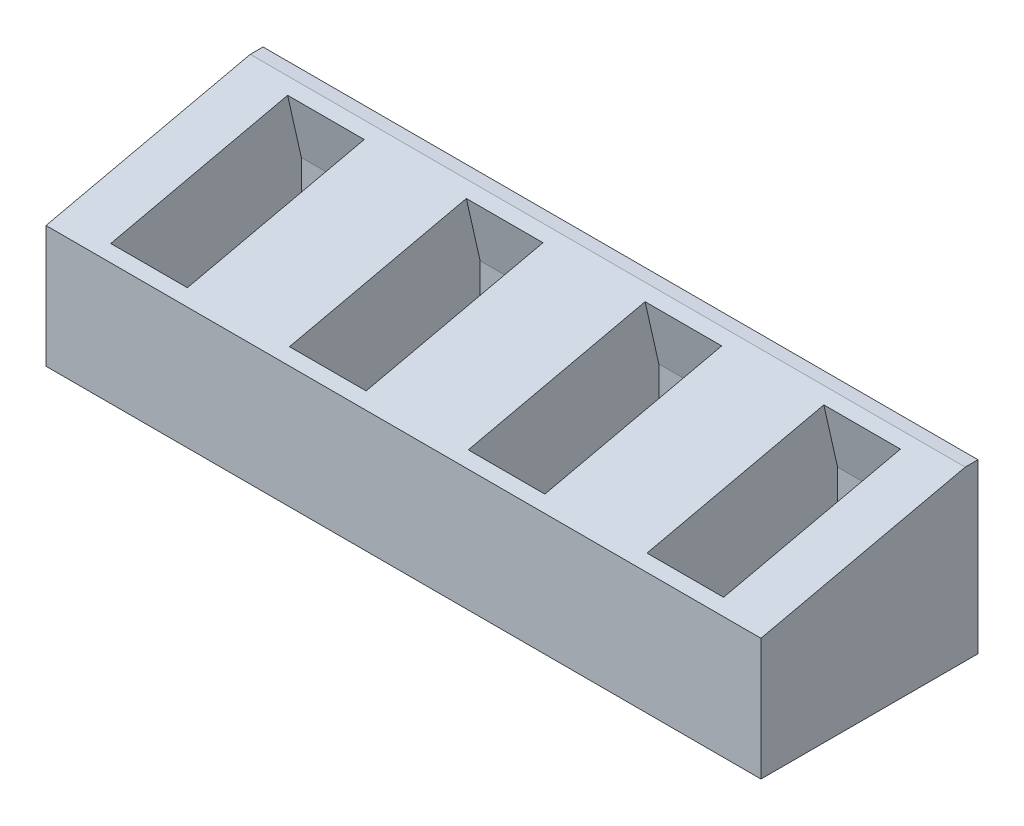
ISO-10303-21;
HEADER;
FILE_DESCRIPTION(('STEP AP214'),'2;1');
FILE_NAME('part.step','',(''),(''),'','','');
FILE_SCHEMA(('AUTOMOTIVE_DESIGN { 1 0 10303 214 1 1 1 1 }'));
ENDSEC;
DATA;
#1=APPLICATION_CONTEXT('core data for automotive mechanical design processes');
#2=APPLICATION_PROTOCOL_DEFINITION('international standard','automotive_design',2000,#1);
#3=PRODUCT_CONTEXT('',#1,'mechanical');
#4=PRODUCT('Part','Part','',(#3));
#5=PRODUCT_RELATED_PRODUCT_CATEGORY('part','',(#4));
#6=PRODUCT_DEFINITION_FORMATION('','',#4);
#7=PRODUCT_DEFINITION_CONTEXT('part definition',#1,'design');
#8=PRODUCT_DEFINITION('design','',#6,#7);
#9=PRODUCT_DEFINITION_SHAPE('','',#8);
#10=(LENGTH_UNIT() NAMED_UNIT(*) SI_UNIT(.MILLI.,.METRE.));
#11=(NAMED_UNIT(*) PLANE_ANGLE_UNIT() SI_UNIT($,.RADIAN.));
#12=(NAMED_UNIT(*) SI_UNIT($,.STERADIAN.) SOLID_ANGLE_UNIT());
#13=UNCERTAINTY_MEASURE_WITH_UNIT(LENGTH_MEASURE(1.E-05),#10,'distance_accuracy_value','');
#14=(GEOMETRIC_REPRESENTATION_CONTEXT(3) GLOBAL_UNCERTAINTY_ASSIGNED_CONTEXT((#13)) GLOBAL_UNIT_ASSIGNED_CONTEXT((#10,
#11,#12)) REPRESENTATION_CONTEXT('',''));
#15=CARTESIAN_POINT('',(0.,0.,0.));
#16=DIRECTION('',(0.,0.,1.));
#17=DIRECTION('',(1.,0.,0.));
#18=AXIS2_PLACEMENT_3D('',#15,#16,#17);
#19=CARTESIAN_POINT('',(0.,0.,203.2));
#20=DIRECTION('',(-1.,0.,0.));
#21=DIRECTION('',(0.,0.,1.));
#22=AXIS2_PLACEMENT_3D('',#19,#20,#21);
#23=PLANE('',#22);
#24=DIRECTION('',(0.,-0.220134843400727,0.975469451454497));
#25=VECTOR('',#24,1.);
#26=CARTESIAN_POINT('',(0.,115.398777640864,229.242119316734));
#27=LINE('',#26,#25);
#28=CARTESIAN_POINT('',(0.,167.132,0.));
#29=VERTEX_POINT('',#28);
#30=CARTESIAN_POINT('',(0.,121.275720121291,203.2));
#31=VERTEX_POINT('',#30);
#32=EDGE_CURVE('E453',#29,#31,#27,.T.);
#33=ORIENTED_EDGE('',*,*,#32,.F.);
#34=DIRECTION('',(0.,0.,1.));
#35=VECTOR('',#34,1.);
#36=CARTESIAN_POINT('',(0.,167.132,-12.7));
#37=LINE('',#36,#35);
#38=CARTESIAN_POINT('',(0.,167.132,-12.7));
#39=VERTEX_POINT('',#38);
#40=EDGE_CURVE('E241',#39,#29,#37,.T.);
#41=ORIENTED_EDGE('',*,*,#40,.F.);
#42=DIRECTION('',(0.,1.,0.));
#43=VECTOR('',#42,1.);
#44=CARTESIAN_POINT('',(0.,167.132,-12.7));
#45=LINE('',#44,#43);
#46=CARTESIAN_POINT('',(0.,0.,-12.7));
#47=VERTEX_POINT('',#46);
#48=EDGE_CURVE('E225',#47,#39,#45,.T.);
#49=ORIENTED_EDGE('',*,*,#48,.F.);
#50=DIRECTION('',(0.,0.,-1.));
#51=VECTOR('',#50,1.);
#52=CARTESIAN_POINT('',(0.,0.,203.2));
#53=LINE('',#52,#51);
#54=CARTESIAN_POINT('',(0.,0.,203.2));
#55=VERTEX_POINT('',#54);
#56=EDGE_CURVE('E216',#55,#47,#53,.T.);
#57=ORIENTED_EDGE('',*,*,#56,.F.);
#58=DIRECTION('',(0.,1.,0.));
#59=VECTOR('',#58,1.);
#60=CARTESIAN_POINT('',(0.,0.,203.2));
#61=LINE('',#60,#59);
#62=EDGE_CURVE('E457',#55,#31,#61,.T.);
#63=ORIENTED_EDGE('',*,*,#62,.T.);
#64=EDGE_LOOP('',(#33,#41,#49,#57,#63));
#65=FACE_BOUND('',#64,.T.);
#66=ADVANCED_FACE('F39',(#65),#23,.T.);
#67=CARTESIAN_POINT('',(0.,0.,203.2));
#68=DIRECTION('',(0.,1.,0.));
#69=DIRECTION('',(0.,0.,1.));
#70=AXIS2_PLACEMENT_3D('',#67,#68,#69);
#71=PLANE('',#70);
#72=ORIENTED_EDGE('',*,*,#56,.T.);
#73=DIRECTION('',(-1.,0.,0.));
#74=VECTOR('',#73,1.);
#75=CARTESIAN_POINT('',(711.2,0.,-12.7));
#76=LINE('',#75,#74);
#77=CARTESIAN_POINT('',(711.2,0.,-12.7));
#78=VERTEX_POINT('',#77);
#79=EDGE_CURVE('E220',#78,#47,#76,.T.);
#80=ORIENTED_EDGE('',*,*,#79,.F.);
#81=DIRECTION('',(0.,0.,-1.));
#82=VECTOR('',#81,1.);
#83=CARTESIAN_POINT('',(711.2,0.,203.2));
#84=LINE('',#83,#82);
#85=CARTESIAN_POINT('',(711.2,0.,203.2));
#86=VERTEX_POINT('',#85);
#87=EDGE_CURVE('E203',#86,#78,#84,.T.);
#88=ORIENTED_EDGE('',*,*,#87,.F.);
#89=DIRECTION('',(1.,0.,0.));
#90=VECTOR('',#89,1.);
#91=CARTESIAN_POINT('',(0.,0.,203.2));
#92=LINE('',#91,#90);
#93=EDGE_CURVE('E217',#55,#86,#92,.T.);
#94=ORIENTED_EDGE('',*,*,#93,.F.);
#95=EDGE_LOOP('',(#72,#80,#88,#94));
#96=FACE_BOUND('',#95,.T.);
#97=ADVANCED_FACE('F221',(#96),#71,.F.);
#98=CARTESIAN_POINT('',(711.2,167.132,203.2));
#99=DIRECTION('',(1.,0.,0.));
#100=DIRECTION('',(0.,0.,-1.));
#101=AXIS2_PLACEMENT_3D('',#98,#99,#100);
#102=PLANE('',#101);
#103=DIRECTION('',(0.,0.220134843400727,-0.975469451454497));
#104=VECTOR('',#103,1.);
#105=CARTESIAN_POINT('',(711.2,167.132,0.));
#106=LINE('',#105,#104);
#107=CARTESIAN_POINT('',(711.2,121.275720121291,203.2));
#108=VERTEX_POINT('',#107);
#109=CARTESIAN_POINT('',(711.2,167.132,0.));
#110=VERTEX_POINT('',#109);
#111=EDGE_CURVE('E446',#108,#110,#106,.T.);
#112=ORIENTED_EDGE('',*,*,#111,.F.);
#113=DIRECTION('',(0.,-1.,0.));
#114=VECTOR('',#113,1.);
#115=CARTESIAN_POINT('',(711.2,167.132,203.2));
#116=LINE('',#115,#114);
#117=EDGE_CURVE('E211',#108,#86,#116,.T.);
#118=ORIENTED_EDGE('',*,*,#117,.T.);
#119=ORIENTED_EDGE('',*,*,#87,.T.);
#120=DIRECTION('',(0.,-1.,0.));
#121=VECTOR('',#120,1.);
#122=CARTESIAN_POINT('',(711.2,167.132,-12.7));
#123=LINE('',#122,#121);
#124=CARTESIAN_POINT('',(711.2,167.132,-12.7));
#125=VERTEX_POINT('',#124);
#126=EDGE_CURVE('E209',#125,#78,#123,.T.);
#127=ORIENTED_EDGE('',*,*,#126,.F.);
#128=DIRECTION('',(0.,0.,1.));
#129=VECTOR('',#128,1.);
#130=CARTESIAN_POINT('',(711.2,167.132,-12.7));
#131=LINE('',#130,#129);
#132=EDGE_CURVE('E238',#125,#110,#131,.T.);
#133=ORIENTED_EDGE('',*,*,#132,.T.);
#134=EDGE_LOOP('',(#112,#118,#119,#127,#133));
#135=FACE_BOUND('',#134,.T.);
#136=ADVANCED_FACE('F206',(#135),#102,.T.);
#137=CARTESIAN_POINT('',(0.,0.,203.2));
#138=DIRECTION('',(0.,0.,-1.));
#139=DIRECTION('',(-1.,0.,0.));
#140=AXIS2_PLACEMENT_3D('',#137,#138,#139);
#141=PLANE('',#140);
#142=ORIENTED_EDGE('',*,*,#117,.F.);
#143=DIRECTION('',(1.,0.,0.));
#144=VECTOR('',#143,1.);
#145=CARTESIAN_POINT('',(-208.28,121.275720121291,203.2));
#146=LINE('',#145,#144);
#147=EDGE_CURVE('E450',#31,#108,#146,.T.);
#148=ORIENTED_EDGE('',*,*,#147,.F.);
#149=ORIENTED_EDGE('',*,*,#62,.F.);
#150=ORIENTED_EDGE('',*,*,#93,.T.);
#151=EDGE_LOOP('',(#142,#148,#149,#150));
#152=FACE_BOUND('',#151,.T.);
#153=ADVANCED_FACE('F504',(#152),#141,.F.);
#154=CARTESIAN_POINT('',(-208.28,167.132,0.));
#155=DIRECTION('',(0.,-0.975469451454497,-0.220134843400727));
#156=DIRECTION('',(0.,0.220134843400727,-0.975469451454497));
#157=AXIS2_PLACEMENT_3D('',#154,#155,#156);
#158=PLANE('',#157);
#159=DIRECTION('',(-1.,0.,0.));
#160=VECTOR('',#159,1.);
#161=CARTESIAN_POINT('',(50.8,164.053418890089,13.6419195623481));
#162=LINE('',#161,#160);
#163=CARTESIAN_POINT('',(127.,164.053418890089,13.6419195623481));
#164=VERTEX_POINT('',#163);
#165=CARTESIAN_POINT('',(50.8,164.053418890089,13.6419195623481));
#166=VERTEX_POINT('',#165);
#167=EDGE_CURVE('E260',#164,#166,#162,.T.);
#168=ORIENTED_EDGE('',*,*,#167,.F.);
#169=DIRECTION('',(0.,0.220134843400727,-0.975469451454497));
#170=VECTOR('',#169,1.);
#171=CARTESIAN_POINT('',(127.,164.053418890089,13.6419195623481));
#172=LINE('',#171,#170);
#173=CARTESIAN_POINT('',(127.,124.354301231202,189.558080437652));
#174=VERTEX_POINT('',#173);
#175=EDGE_CURVE('E257',#174,#164,#172,.T.);
#176=ORIENTED_EDGE('',*,*,#175,.F.);
#177=DIRECTION('',(1.,0.,0.));
#178=VECTOR('',#177,1.);
#179=CARTESIAN_POINT('',(50.8,124.354301231202,189.558080437652));
#180=LINE('',#179,#178);
#181=CARTESIAN_POINT('',(50.8,124.354301231202,189.558080437652));
#182=VERTEX_POINT('',#181);
#183=EDGE_CURVE('E249',#182,#174,#180,.T.);
#184=ORIENTED_EDGE('',*,*,#183,.F.);
#185=DIRECTION('',(0.,-0.220134843400727,0.975469451454497));
#186=VECTOR('',#185,1.);
#187=CARTESIAN_POINT('',(50.8,164.053418890089,13.6419195623481));
#188=LINE('',#187,#186);
#189=EDGE_CURVE('E265',#166,#182,#188,.T.);
#190=ORIENTED_EDGE('',*,*,#189,.F.);
#191=EDGE_LOOP('',(#168,#176,#184,#190));
#192=FACE_BOUND('',#191,.T.);
#193=DIRECTION('',(0.,-0.220134843400727,0.975469451454497));
#194=VECTOR('',#193,1.);
#195=CARTESIAN_POINT('',(228.6,164.053418890089,13.6419195623481));
#196=LINE('',#195,#194);
#197=CARTESIAN_POINT('',(228.6,164.053418890089,13.6419195623476));
#198=VERTEX_POINT('',#197);
#199=CARTESIAN_POINT('',(228.6,124.354301231202,189.558080437652));
#200=VERTEX_POINT('',#199);
#201=EDGE_CURVE('E300',#198,#200,#196,.T.);
#202=ORIENTED_EDGE('',*,*,#201,.F.);
#203=DIRECTION('',(-1.,0.,0.));
#204=VECTOR('',#203,1.);
#205=CARTESIAN_POINT('',(304.8,164.053418890089,13.6419195623481));
#206=LINE('',#205,#204);
#207=CARTESIAN_POINT('',(304.8,164.053418890089,13.6419195623481));
#208=VERTEX_POINT('',#207);
#209=EDGE_CURVE('E297',#208,#198,#206,.T.);
#210=ORIENTED_EDGE('',*,*,#209,.F.);
#211=DIRECTION('',(0.,0.220134843400727,-0.975469451454497));
#212=VECTOR('',#211,1.);
#213=CARTESIAN_POINT('',(304.8,164.053418890089,13.6419195623481));
#214=LINE('',#213,#212);
#215=CARTESIAN_POINT('',(304.8,124.354301231202,189.558080437652));
#216=VERTEX_POINT('',#215);
#217=EDGE_CURVE('E289',#216,#208,#214,.T.);
#218=ORIENTED_EDGE('',*,*,#217,.F.);
#219=DIRECTION('',(1.,0.,0.));
#220=VECTOR('',#219,1.);
#221=CARTESIAN_POINT('',(304.8,124.354301231202,189.558080437652));
#222=LINE('',#221,#220);
#223=EDGE_CURVE('E305',#200,#216,#222,.T.);
#224=ORIENTED_EDGE('',*,*,#223,.F.);
#225=EDGE_LOOP('',(#202,#210,#218,#224));
#226=FACE_BOUND('',#225,.T.);
#227=DIRECTION('',(1.,0.,0.));
#228=VECTOR('',#227,1.);
#229=CARTESIAN_POINT('',(406.4,124.354301231202,189.558080437652));
#230=LINE('',#229,#228);
#231=CARTESIAN_POINT('',(406.4,124.354301231202,189.558080437652));
#232=VERTEX_POINT('',#231);
#233=CARTESIAN_POINT('',(482.6,124.354301231202,189.558080437652));
#234=VERTEX_POINT('',#233);
#235=EDGE_CURVE('E339',#232,#234,#230,.T.);
#236=ORIENTED_EDGE('',*,*,#235,.F.);
#237=DIRECTION('',(0.,-0.220134843400727,0.975469451454497));
#238=VECTOR('',#237,1.);
#239=CARTESIAN_POINT('',(406.4,164.053418890089,13.6419195623481));
#240=LINE('',#239,#238);
#241=CARTESIAN_POINT('',(406.4,164.053418890089,13.6419195623481));
#242=VERTEX_POINT('',#241);
#243=EDGE_CURVE('E336',#242,#232,#240,.T.);
#244=ORIENTED_EDGE('',*,*,#243,.F.);
#245=DIRECTION('',(-1.,0.,0.));
#246=VECTOR('',#245,1.);
#247=CARTESIAN_POINT('',(406.4,164.053418890089,13.6419195623481));
#248=LINE('',#247,#246);
#249=CARTESIAN_POINT('',(482.6,164.053418890089,13.6419195623481));
#250=VERTEX_POINT('',#249);
#251=EDGE_CURVE('E327',#250,#242,#248,.T.);
#252=ORIENTED_EDGE('',*,*,#251,.F.);
#253=DIRECTION('',(0.,0.220134843400727,-0.975469451454497));
#254=VECTOR('',#253,1.);
#255=CARTESIAN_POINT('',(482.6,164.053418890089,13.6419195623481));
#256=LINE('',#255,#254);
#257=EDGE_CURVE('E344',#234,#250,#256,.T.);
#258=ORIENTED_EDGE('',*,*,#257,.F.);
#259=EDGE_LOOP('',(#236,#244,#252,#258));
#260=FACE_BOUND('',#259,.T.);
#261=DIRECTION('',(-1.,0.,0.));
#262=VECTOR('',#261,1.);
#263=CARTESIAN_POINT('',(660.4,164.053418890089,13.6419195623481));
#264=LINE('',#263,#262);
#265=CARTESIAN_POINT('',(660.4,164.053418890089,13.6419195623481));
#266=VERTEX_POINT('',#265);
#267=CARTESIAN_POINT('',(584.2,164.053418890089,13.6419195623481));
#268=VERTEX_POINT('',#267);
#269=EDGE_CURVE('E377',#266,#268,#264,.T.);
#270=ORIENTED_EDGE('',*,*,#269,.F.);
#271=DIRECTION('',(0.,0.220134843400727,-0.975469451454497));
#272=VECTOR('',#271,1.);
#273=CARTESIAN_POINT('',(660.4,164.053418890089,13.6419195623481));
#274=LINE('',#273,#272);
#275=CARTESIAN_POINT('',(660.4,124.354301231202,189.558080437652));
#276=VERTEX_POINT('',#275);
#277=EDGE_CURVE('E244',#276,#266,#274,.T.);
#278=ORIENTED_EDGE('',*,*,#277,.F.);
#279=DIRECTION('',(1.,0.,0.));
#280=VECTOR('',#279,1.);
#281=CARTESIAN_POINT('',(660.4,124.354301231202,189.558080437652));
#282=LINE('',#281,#280);
#283=CARTESIAN_POINT('',(584.2,124.354301231202,189.558080437652));
#284=VERTEX_POINT('',#283);
#285=EDGE_CURVE('E367',#284,#276,#282,.T.);
#286=ORIENTED_EDGE('',*,*,#285,.F.);
#287=DIRECTION('',(0.,-0.220134843400727,0.975469451454497));
#288=VECTOR('',#287,1.);
#289=CARTESIAN_POINT('',(584.2,164.053418890089,13.6419195623481));
#290=LINE('',#289,#288);
#291=EDGE_CURVE('E381',#268,#284,#290,.T.);
#292=ORIENTED_EDGE('',*,*,#291,.F.);
#293=EDGE_LOOP('',(#270,#278,#286,#292));
#294=FACE_BOUND('',#293,.T.);
#295=ORIENTED_EDGE('',*,*,#32,.T.);
#296=ORIENTED_EDGE('',*,*,#147,.T.);
#297=ORIENTED_EDGE('',*,*,#111,.T.);
#298=DIRECTION('',(1.,0.,0.));
#299=VECTOR('',#298,1.);
#300=CARTESIAN_POINT('',(0.,167.132,0.));
#301=LINE('',#300,#299);
#302=EDGE_CURVE('E456',#29,#110,#301,.T.);
#303=ORIENTED_EDGE('',*,*,#302,.F.);
#304=EDGE_LOOP('',(#295,#296,#297,#303));
#305=FACE_BOUND('',#304,.T.);
#306=ADVANCED_FACE('F500',(#192,#226,#260,#294,#305),#158,.F.);
#307=CARTESIAN_POINT('',(660.4,52.5572605888403,-11.519493038355));
#308=DIRECTION('',(1.,0.,0.));
#309=DIRECTION('',(0.,0.,-1.));
#310=AXIS2_PLACEMENT_3D('',#307,#308,#309);
#311=PLANE('',#310);
#312=DIRECTION('',(0.,-1.,0.));
#313=VECTOR('',#312,1.);
#314=CARTESIAN_POINT('',(660.4,0.,0.));
#315=LINE('',#314,#313);
#316=CARTESIAN_POINT('',(660.4,103.602853288142,0.));
#317=VERTEX_POINT('',#316);
#318=CARTESIAN_POINT('',(660.4,49.9576488918539,0.));
#319=VERTEX_POINT('',#318);
#320=EDGE_CURVE('E406',#317,#319,#315,.T.);
#321=ORIENTED_EDGE('',*,*,#320,.T.);
#322=DIRECTION('',(0.,0.220134843400727,-0.975469451454497));
#323=VECTOR('',#322,1.);
#324=CARTESIAN_POINT('',(660.4,52.5572605888403,-11.519493038355));
#325=LINE('',#324,#323);
#326=CARTESIAN_POINT('',(660.4,12.8581429299532,164.396667836949));
#327=VERTEX_POINT('',#326);
#328=EDGE_CURVE('E362',#327,#319,#325,.T.);
#329=ORIENTED_EDGE('',*,*,#328,.F.);
#330=DIRECTION('',(0.,0.975469451454497,0.220134843400727));
#331=VECTOR('',#330,1.);
#332=CARTESIAN_POINT('',(660.4,12.8581429299532,164.396667836949));
#333=LINE('',#332,#331);
#334=EDGE_CURVE('E340',#327,#276,#333,.T.);
#335=ORIENTED_EDGE('',*,*,#334,.T.);
#336=ORIENTED_EDGE('',*,*,#277,.T.);
#337=DIRECTION('',(0.,0.975469451454497,0.220134843400727));
#338=VECTOR('',#337,1.);
#339=CARTESIAN_POINT('',(660.4,52.5572605888403,-11.519493038355));
#340=LINE('',#339,#338);
#341=EDGE_CURVE('E374',#317,#266,#340,.T.);
#342=ORIENTED_EDGE('',*,*,#341,.F.);
#343=EDGE_LOOP('',(#321,#329,#335,#336,#342));
#344=FACE_BOUND('',#343,.T.);
#345=ADVANCED_FACE('F503',(#344),#311,.F.);
#346=CARTESIAN_POINT('',(660.4,12.8581429299532,164.396667836949));
#347=DIRECTION('',(0.,-0.220134843400727,0.975469451454497));
#348=DIRECTION('',(0.,-0.975469451454497,-0.220134843400727));
#349=AXIS2_PLACEMENT_3D('',#346,#347,#348);
#350=PLANE('',#349);
#351=ORIENTED_EDGE('',*,*,#285,.T.);
#352=ORIENTED_EDGE('',*,*,#334,.F.);
#353=DIRECTION('',(1.,0.,0.));
#354=VECTOR('',#353,1.);
#355=CARTESIAN_POINT('',(660.4,12.8581429299532,164.396667836949));
#356=LINE('',#355,#354);
#357=CARTESIAN_POINT('',(584.2,12.8581429299532,164.396667836949));
#358=VERTEX_POINT('',#357);
#359=EDGE_CURVE('E370',#358,#327,#356,.T.);
#360=ORIENTED_EDGE('',*,*,#359,.F.);
#361=DIRECTION('',(0.,0.975469451454497,0.220134843400727));
#362=VECTOR('',#361,1.);
#363=CARTESIAN_POINT('',(584.2,12.8581429299532,164.396667836949));
#364=LINE('',#363,#362);
#365=EDGE_CURVE('E390',#358,#284,#364,.T.);
#366=ORIENTED_EDGE('',*,*,#365,.T.);
#367=EDGE_LOOP('',(#351,#352,#360,#366));
#368=FACE_BOUND('',#367,.T.);
#369=ADVANCED_FACE('F545',(#368),#350,.F.);
#370=CARTESIAN_POINT('',(584.2,52.5572605888403,-11.519493038355));
#371=DIRECTION('',(-1.,0.,0.));
#372=DIRECTION('',(0.,0.,1.));
#373=AXIS2_PLACEMENT_3D('',#370,#371,#372);
#374=PLANE('',#373);
#375=DIRECTION('',(0.,1.,0.));
#376=VECTOR('',#375,1.);
#377=CARTESIAN_POINT('',(584.2,0.,0.));
#378=LINE('',#377,#376);
#379=CARTESIAN_POINT('',(584.2,49.9576488918539,0.));
#380=VERTEX_POINT('',#379);
#381=CARTESIAN_POINT('',(584.2,103.602853288142,0.));
#382=VERTEX_POINT('',#381);
#383=EDGE_CURVE('E402',#380,#382,#378,.T.);
#384=ORIENTED_EDGE('',*,*,#383,.T.);
#385=DIRECTION('',(0.,0.975469451454497,0.220134843400727));
#386=VECTOR('',#385,1.);
#387=CARTESIAN_POINT('',(584.2,52.5572605888403,-11.519493038355));
#388=LINE('',#387,#386);
#389=EDGE_CURVE('E393',#382,#268,#388,.T.);
#390=ORIENTED_EDGE('',*,*,#389,.T.);
#391=ORIENTED_EDGE('',*,*,#291,.T.);
#392=ORIENTED_EDGE('',*,*,#365,.F.);
#393=DIRECTION('',(0.,-0.220134843400727,0.975469451454497));
#394=VECTOR('',#393,1.);
#395=CARTESIAN_POINT('',(584.2,52.5572605888403,-11.519493038355));
#396=LINE('',#395,#394);
#397=EDGE_CURVE('E366',#380,#358,#396,.T.);
#398=ORIENTED_EDGE('',*,*,#397,.F.);
#399=EDGE_LOOP('',(#384,#390,#391,#392,#398));
#400=FACE_BOUND('',#399,.T.);
#401=ADVANCED_FACE('F551',(#400),#374,.F.);
#402=CARTESIAN_POINT('',(660.4,52.5572605888403,-11.519493038355));
#403=DIRECTION('',(0.,0.220134843400727,-0.975469451454497));
#404=DIRECTION('',(0.,0.975469451454497,0.220134843400727));
#405=AXIS2_PLACEMENT_3D('',#402,#403,#404);
#406=PLANE('',#405);
#407=DIRECTION('',(1.,0.,0.));
#408=VECTOR('',#407,1.);
#409=CARTESIAN_POINT('',(0.,103.602853288142,0.));
#410=LINE('',#409,#408);
#411=EDGE_CURVE('E275',#382,#317,#410,.T.);
#412=ORIENTED_EDGE('',*,*,#411,.T.);
#413=ORIENTED_EDGE('',*,*,#341,.T.);
#414=ORIENTED_EDGE('',*,*,#269,.T.);
#415=ORIENTED_EDGE('',*,*,#389,.F.);
#416=EDGE_LOOP('',(#412,#413,#414,#415));
#417=FACE_BOUND('',#416,.T.);
#418=ADVANCED_FACE('F547',(#417),#406,.F.);
#419=CARTESIAN_POINT('',(0.,47.5367337350428,10.7276464895363));
#420=DIRECTION('',(0.,-0.975469451454497,-0.220134843400727));
#421=DIRECTION('',(0.,0.220134843400727,-0.975469451454497));
#422=AXIS2_PLACEMENT_3D('',#419,#420,#421);
#423=PLANE('',#422);
#424=DIRECTION('',(-1.,0.,0.));
#425=VECTOR('',#424,1.);
#426=CARTESIAN_POINT('',(0.,49.9576488918539,0.));
#427=LINE('',#426,#425);
#428=EDGE_CURVE('E468',#319,#380,#427,.T.);
#429=ORIENTED_EDGE('',*,*,#428,.T.);
#430=ORIENTED_EDGE('',*,*,#397,.T.);
#431=ORIENTED_EDGE('',*,*,#359,.T.);
#432=ORIENTED_EDGE('',*,*,#328,.T.);
#433=EDGE_LOOP('',(#429,#430,#431,#432));
#434=FACE_BOUND('',#433,.T.);
#435=ADVANCED_FACE('F550',(#434),#423,.F.);
#436=CARTESIAN_POINT('',(406.4,52.5572605888403,-11.519493038355));
#437=DIRECTION('',(-1.,0.,0.));
#438=DIRECTION('',(0.,0.,1.));
#439=AXIS2_PLACEMENT_3D('',#436,#437,#438);
#440=PLANE('',#439);
#441=DIRECTION('',(0.,1.,0.));
#442=VECTOR('',#441,1.);
#443=CARTESIAN_POINT('',(406.4,0.,0.));
#444=LINE('',#443,#442);
#445=CARTESIAN_POINT('',(406.4,49.9576488918539,0.));
#446=VERTEX_POINT('',#445);
#447=CARTESIAN_POINT('',(406.4,103.602853288142,0.));
#448=VERTEX_POINT('',#447);
#449=EDGE_CURVE('E418',#446,#448,#444,.T.);
#450=ORIENTED_EDGE('',*,*,#449,.T.);
#451=DIRECTION('',(0.,0.975469451454497,0.220134843400727));
#452=VECTOR('',#451,1.);
#453=CARTESIAN_POINT('',(406.4,52.5572605888403,-11.519493038355));
#454=LINE('',#453,#452);
#455=EDGE_CURVE('E301',#448,#242,#454,.T.);
#456=ORIENTED_EDGE('',*,*,#455,.T.);
#457=ORIENTED_EDGE('',*,*,#243,.T.);
#458=DIRECTION('',(0.,0.975469451454497,0.220134843400727));
#459=VECTOR('',#458,1.);
#460=CARTESIAN_POINT('',(406.4,12.8581429299532,164.396667836949));
#461=LINE('',#460,#459);
#462=CARTESIAN_POINT('',(406.4,12.8581429299532,164.396667836949));
#463=VERTEX_POINT('',#462);
#464=EDGE_CURVE('E335',#463,#232,#461,.T.);
#465=ORIENTED_EDGE('',*,*,#464,.F.);
#466=DIRECTION('',(0.,-0.220134843400727,0.975469451454497));
#467=VECTOR('',#466,1.);
#468=CARTESIAN_POINT('',(406.4,52.5572605888403,-11.519493038355));
#469=LINE('',#468,#467);
#470=EDGE_CURVE('E323',#446,#463,#469,.T.);
#471=ORIENTED_EDGE('',*,*,#470,.F.);
#472=EDGE_LOOP('',(#450,#456,#457,#465,#471));
#473=FACE_BOUND('',#472,.T.);
#474=ADVANCED_FACE('F494',(#473),#440,.F.);
#475=CARTESIAN_POINT('',(406.4,52.5572605888403,-11.519493038355));
#476=DIRECTION('',(0.,0.220134843400727,-0.975469451454497));
#477=DIRECTION('',(0.,0.975469451454497,0.220134843400727));
#478=AXIS2_PLACEMENT_3D('',#475,#476,#477);
#479=PLANE('',#478);
#480=DIRECTION('',(1.,0.,0.));
#481=VECTOR('',#480,1.);
#482=CARTESIAN_POINT('',(0.,103.602853288142,0.));
#483=LINE('',#482,#481);
#484=CARTESIAN_POINT('',(482.6,103.602853288142,0.));
#485=VERTEX_POINT('',#484);
#486=EDGE_CURVE('E414',#448,#485,#483,.T.);
#487=ORIENTED_EDGE('',*,*,#486,.T.);
#488=DIRECTION('',(0.,0.975469451454497,0.220134843400727));
#489=VECTOR('',#488,1.);
#490=CARTESIAN_POINT('',(482.6,52.5572605888403,-11.519493038355));
#491=LINE('',#490,#489);
#492=EDGE_CURVE('E353',#485,#250,#491,.T.);
#493=ORIENTED_EDGE('',*,*,#492,.T.);
#494=ORIENTED_EDGE('',*,*,#251,.T.);
#495=ORIENTED_EDGE('',*,*,#455,.F.);
#496=EDGE_LOOP('',(#487,#493,#494,#495));
#497=FACE_BOUND('',#496,.T.);
#498=ADVANCED_FACE('F490',(#497),#479,.F.);
#499=CARTESIAN_POINT('',(482.6,52.5572605888403,-11.519493038355));
#500=DIRECTION('',(1.,0.,0.));
#501=DIRECTION('',(0.,0.,-1.));
#502=AXIS2_PLACEMENT_3D('',#499,#500,#501);
#503=PLANE('',#502);
#504=DIRECTION('',(0.,-1.,0.));
#505=VECTOR('',#504,1.);
#506=CARTESIAN_POINT('',(482.6,0.,0.));
#507=LINE('',#506,#505);
#508=CARTESIAN_POINT('',(482.6,49.9576488918539,0.));
#509=VERTEX_POINT('',#508);
#510=EDGE_CURVE('E410',#485,#509,#507,.T.);
#511=ORIENTED_EDGE('',*,*,#510,.T.);
#512=DIRECTION('',(0.,0.220134843400727,-0.975469451454497));
#513=VECTOR('',#512,1.);
#514=CARTESIAN_POINT('',(482.6,52.5572605888403,-11.519493038355));
#515=LINE('',#514,#513);
#516=CARTESIAN_POINT('',(482.6,12.8581429299532,164.396667836949));
#517=VERTEX_POINT('',#516);
#518=EDGE_CURVE('E331',#517,#509,#515,.T.);
#519=ORIENTED_EDGE('',*,*,#518,.F.);
#520=DIRECTION('',(0.,0.975469451454497,0.220134843400727));
#521=VECTOR('',#520,1.);
#522=CARTESIAN_POINT('',(482.6,12.8581429299532,164.396667836949));
#523=LINE('',#522,#521);
#524=EDGE_CURVE('E356',#517,#234,#523,.T.);
#525=ORIENTED_EDGE('',*,*,#524,.T.);
#526=ORIENTED_EDGE('',*,*,#257,.T.);
#527=ORIENTED_EDGE('',*,*,#492,.F.);
#528=EDGE_LOOP('',(#511,#519,#525,#526,#527));
#529=FACE_BOUND('',#528,.T.);
#530=ADVANCED_FACE('F486',(#529),#503,.F.);
#531=CARTESIAN_POINT('',(406.4,12.8581429299532,164.396667836949));
#532=DIRECTION('',(0.,-0.220134843400727,0.975469451454497));
#533=DIRECTION('',(0.,-0.975469451454497,-0.220134843400727));
#534=AXIS2_PLACEMENT_3D('',#531,#532,#533);
#535=PLANE('',#534);
#536=ORIENTED_EDGE('',*,*,#235,.T.);
#537=ORIENTED_EDGE('',*,*,#524,.F.);
#538=DIRECTION('',(1.,0.,0.));
#539=VECTOR('',#538,1.);
#540=CARTESIAN_POINT('',(406.4,12.8581429299532,164.396667836949));
#541=LINE('',#540,#539);
#542=EDGE_CURVE('E326',#463,#517,#541,.T.);
#543=ORIENTED_EDGE('',*,*,#542,.F.);
#544=ORIENTED_EDGE('',*,*,#464,.T.);
#545=EDGE_LOOP('',(#536,#537,#543,#544));
#546=FACE_BOUND('',#545,.T.);
#547=ADVANCED_FACE('F498',(#546),#535,.F.);
#548=CARTESIAN_POINT('',(0.,47.5367337350428,10.7276464895363));
#549=DIRECTION('',(0.,0.975469451454497,0.220134843400727));
#550=DIRECTION('',(0.,-0.220134843400727,0.975469451454497));
#551=AXIS2_PLACEMENT_3D('',#548,#549,#550);
#552=PLANE('',#551);
#553=ORIENTED_EDGE('',*,*,#470,.T.);
#554=ORIENTED_EDGE('',*,*,#542,.T.);
#555=ORIENTED_EDGE('',*,*,#518,.T.);
#556=DIRECTION('',(1.,0.,0.));
#557=VECTOR('',#556,1.);
#558=CARTESIAN_POINT('',(0.,49.9576488918539,0.));
#559=LINE('',#558,#557);
#560=EDGE_CURVE('E473',#446,#509,#559,.T.);
#561=ORIENTED_EDGE('',*,*,#560,.F.);
#562=EDGE_LOOP('',(#553,#554,#555,#561));
#563=FACE_BOUND('',#562,.T.);
#564=ADVANCED_FACE('F482',(#563),#552,.T.);
#565=CARTESIAN_POINT('',(304.8,52.5572605888403,-11.519493038355));
#566=DIRECTION('',(0.,0.220134843400727,-0.975469451454497));
#567=DIRECTION('',(0.,0.975469451454497,0.220134843400727));
#568=AXIS2_PLACEMENT_3D('',#565,#566,#567);
#569=PLANE('',#568);
#570=DIRECTION('',(1.,0.,0.));
#571=VECTOR('',#570,1.);
#572=CARTESIAN_POINT('',(0.,103.602853288142,0.));
#573=LINE('',#572,#571);
#574=CARTESIAN_POINT('',(228.6,103.602853288142,0.));
#575=VERTEX_POINT('',#574);
#576=CARTESIAN_POINT('',(304.8,103.602853288142,0.));
#577=VERTEX_POINT('',#576);
#578=EDGE_CURVE('E430',#575,#577,#573,.T.);
#579=ORIENTED_EDGE('',*,*,#578,.T.);
#580=DIRECTION('',(0.,0.975469451454497,0.220134843400727));
#581=VECTOR('',#580,1.);
#582=CARTESIAN_POINT('',(304.8,52.5572605888403,-11.519493038355));
#583=LINE('',#582,#581);
#584=EDGE_CURVE('E261',#577,#208,#583,.T.);
#585=ORIENTED_EDGE('',*,*,#584,.T.);
#586=ORIENTED_EDGE('',*,*,#209,.T.);
#587=DIRECTION('',(0.,0.975469451454497,0.220134843400727));
#588=VECTOR('',#587,1.);
#589=CARTESIAN_POINT('',(228.6,52.5572605888403,-11.519493038355));
#590=LINE('',#589,#588);
#591=EDGE_CURVE('E296',#575,#198,#590,.T.);
#592=ORIENTED_EDGE('',*,*,#591,.F.);
#593=EDGE_LOOP('',(#579,#585,#586,#592));
#594=FACE_BOUND('',#593,.T.);
#595=ADVANCED_FACE('F572',(#594),#569,.F.);
#596=CARTESIAN_POINT('',(304.8,52.5572605888403,-11.519493038355));
#597=DIRECTION('',(1.,0.,0.));
#598=DIRECTION('',(0.,0.,-1.));
#599=AXIS2_PLACEMENT_3D('',#596,#597,#598);
#600=PLANE('',#599);
#601=DIRECTION('',(0.,-1.,0.));
#602=VECTOR('',#601,1.);
#603=CARTESIAN_POINT('',(304.8,0.,0.));
#604=LINE('',#603,#602);
#605=CARTESIAN_POINT('',(304.8,49.9576488918539,0.));
#606=VERTEX_POINT('',#605);
#607=EDGE_CURVE('E426',#577,#606,#604,.T.);
#608=ORIENTED_EDGE('',*,*,#607,.T.);
#609=DIRECTION('',(0.,0.220134843400727,-0.975469451454497));
#610=VECTOR('',#609,1.);
#611=CARTESIAN_POINT('',(304.8,52.5572605888403,-11.519493038355));
#612=LINE('',#611,#610);
#613=CARTESIAN_POINT('',(304.8,12.8581429299532,164.396667836949));
#614=VERTEX_POINT('',#613);
#615=EDGE_CURVE('E293',#614,#606,#612,.T.);
#616=ORIENTED_EDGE('',*,*,#615,.F.);
#617=DIRECTION('',(0.,0.975469451454497,0.220134843400727));
#618=VECTOR('',#617,1.);
#619=CARTESIAN_POINT('',(304.8,12.8581429299532,164.396667836949));
#620=LINE('',#619,#618);
#621=EDGE_CURVE('E314',#614,#216,#620,.T.);
#622=ORIENTED_EDGE('',*,*,#621,.T.);
#623=ORIENTED_EDGE('',*,*,#217,.T.);
#624=ORIENTED_EDGE('',*,*,#584,.F.);
#625=EDGE_LOOP('',(#608,#616,#622,#623,#624));
#626=FACE_BOUND('',#625,.T.);
#627=ADVANCED_FACE('F575',(#626),#600,.F.);
#628=CARTESIAN_POINT('',(304.8,12.8581429299532,164.396667836949));
#629=DIRECTION('',(0.,-0.220134843400727,0.975469451454497));
#630=DIRECTION('',(0.,-0.975469451454497,-0.220134843400727));
#631=AXIS2_PLACEMENT_3D('',#628,#629,#630);
#632=PLANE('',#631);
#633=ORIENTED_EDGE('',*,*,#223,.T.);
#634=ORIENTED_EDGE('',*,*,#621,.F.);
#635=DIRECTION('',(1.,0.,0.));
#636=VECTOR('',#635,1.);
#637=CARTESIAN_POINT('',(304.8,12.8581429299532,164.396667836949));
#638=LINE('',#637,#636);
#639=CARTESIAN_POINT('',(228.6,12.8581429299532,164.396667836949));
#640=VERTEX_POINT('',#639);
#641=EDGE_CURVE('E288',#640,#614,#638,.T.);
#642=ORIENTED_EDGE('',*,*,#641,.F.);
#643=DIRECTION('',(0.,0.975469451454497,0.220134843400727));
#644=VECTOR('',#643,1.);
#645=CARTESIAN_POINT('',(228.6,12.8581429299532,164.396667836949));
#646=LINE('',#645,#644);
#647=EDGE_CURVE('E317',#640,#200,#646,.T.);
#648=ORIENTED_EDGE('',*,*,#647,.T.);
#649=EDGE_LOOP('',(#633,#634,#642,#648));
#650=FACE_BOUND('',#649,.T.);
#651=ADVANCED_FACE('F581',(#650),#632,.F.);
#652=CARTESIAN_POINT('',(228.6,52.5572605888403,-11.519493038355));
#653=DIRECTION('',(-1.,0.,0.));
#654=DIRECTION('',(0.,0.,1.));
#655=AXIS2_PLACEMENT_3D('',#652,#653,#654);
#656=PLANE('',#655);
#657=DIRECTION('',(0.,1.,0.));
#658=VECTOR('',#657,1.);
#659=CARTESIAN_POINT('',(228.6,0.,0.));
#660=LINE('',#659,#658);
#661=CARTESIAN_POINT('',(228.6,49.9576488918539,0.));
#662=VERTEX_POINT('',#661);
#663=EDGE_CURVE('E422',#662,#575,#660,.T.);
#664=ORIENTED_EDGE('',*,*,#663,.T.);
#665=ORIENTED_EDGE('',*,*,#591,.T.);
#666=ORIENTED_EDGE('',*,*,#201,.T.);
#667=ORIENTED_EDGE('',*,*,#647,.F.);
#668=DIRECTION('',(0.,-0.220134843400727,0.975469451454497));
#669=VECTOR('',#668,1.);
#670=CARTESIAN_POINT('',(228.6,52.5572605888403,-11.519493038355));
#671=LINE('',#670,#669);
#672=EDGE_CURVE('E285',#662,#640,#671,.T.);
#673=ORIENTED_EDGE('',*,*,#672,.F.);
#674=EDGE_LOOP('',(#664,#665,#666,#667,#673));
#675=FACE_BOUND('',#674,.T.);
#676=ADVANCED_FACE('F577',(#675),#656,.F.);
#677=CARTESIAN_POINT('',(0.,47.5367337350428,10.7276464895363));
#678=DIRECTION('',(0.,0.975469451454497,0.220134843400727));
#679=DIRECTION('',(0.,-0.220134843400727,0.975469451454497));
#680=AXIS2_PLACEMENT_3D('',#677,#678,#679);
#681=PLANE('',#680);
#682=ORIENTED_EDGE('',*,*,#672,.T.);
#683=ORIENTED_EDGE('',*,*,#641,.T.);
#684=ORIENTED_EDGE('',*,*,#615,.T.);
#685=DIRECTION('',(1.,0.,0.));
#686=VECTOR('',#685,1.);
#687=CARTESIAN_POINT('',(0.,49.9576488918539,0.));
#688=LINE('',#687,#686);
#689=EDGE_CURVE('E47',#662,#606,#688,.T.);
#690=ORIENTED_EDGE('',*,*,#689,.F.);
#691=EDGE_LOOP('',(#682,#683,#684,#690));
#692=FACE_BOUND('',#691,.T.);
#693=ADVANCED_FACE('F580',(#692),#681,.T.);
#694=CARTESIAN_POINT('',(127.,52.5572605888403,-11.519493038355));
#695=DIRECTION('',(1.,0.,0.));
#696=DIRECTION('',(0.,0.,-1.));
#697=AXIS2_PLACEMENT_3D('',#694,#695,#696);
#698=PLANE('',#697);
#699=DIRECTION('',(0.,-1.,0.));
#700=VECTOR('',#699,1.);
#701=CARTESIAN_POINT('',(127.,0.,0.));
#702=LINE('',#701,#700);
#703=CARTESIAN_POINT('',(127.,103.602853288142,0.));
#704=VERTEX_POINT('',#703);
#705=CARTESIAN_POINT('',(127.,49.9576488918539,0.));
#706=VERTEX_POINT('',#705);
#707=EDGE_CURVE('E442',#704,#706,#702,.T.);
#708=ORIENTED_EDGE('',*,*,#707,.T.);
#709=DIRECTION('',(0.,0.220134843400727,-0.975469451454497));
#710=VECTOR('',#709,1.);
#711=CARTESIAN_POINT('',(127.,52.5572605888403,-11.519493038355));
#712=LINE('',#711,#710);
#713=CARTESIAN_POINT('',(127.,12.8581429299532,164.396667836949));
#714=VERTEX_POINT('',#713);
#715=EDGE_CURVE('E245',#714,#706,#712,.T.);
#716=ORIENTED_EDGE('',*,*,#715,.F.);
#717=DIRECTION('',(0.,0.975469451454497,0.220134843400727));
#718=VECTOR('',#717,1.);
#719=CARTESIAN_POINT('',(127.,12.8581429299532,164.396667836949));
#720=LINE('',#719,#718);
#721=EDGE_CURVE('E272',#714,#174,#720,.T.);
#722=ORIENTED_EDGE('',*,*,#721,.T.);
#723=ORIENTED_EDGE('',*,*,#175,.T.);
#724=DIRECTION('',(0.,0.975469451454497,0.220134843400727));
#725=VECTOR('',#724,1.);
#726=CARTESIAN_POINT('',(127.,52.5572605888403,-11.519493038355));
#727=LINE('',#726,#725);
#728=EDGE_CURVE('E256',#704,#164,#727,.T.);
#729=ORIENTED_EDGE('',*,*,#728,.F.);
#730=EDGE_LOOP('',(#708,#716,#722,#723,#729));
#731=FACE_BOUND('',#730,.T.);
#732=ADVANCED_FACE('F591',(#731),#698,.F.);
#733=CARTESIAN_POINT('',(50.8,12.8581429299532,164.396667836949));
#734=DIRECTION('',(0.,-0.220134843400727,0.975469451454497));
#735=DIRECTION('',(0.,-0.975469451454497,-0.220134843400727));
#736=AXIS2_PLACEMENT_3D('',#733,#734,#735);
#737=PLANE('',#736);
#738=ORIENTED_EDGE('',*,*,#183,.T.);
#739=ORIENTED_EDGE('',*,*,#721,.F.);
#740=DIRECTION('',(1.,0.,0.));
#741=VECTOR('',#740,1.);
#742=CARTESIAN_POINT('',(50.8,12.8581429299532,164.396667836949));
#743=LINE('',#742,#741);
#744=CARTESIAN_POINT('',(50.8,12.8581429299532,164.396667836949));
#745=VERTEX_POINT('',#744);
#746=EDGE_CURVE('E252',#745,#714,#743,.T.);
#747=ORIENTED_EDGE('',*,*,#746,.F.);
#748=DIRECTION('',(0.,0.975469451454497,0.220134843400727));
#749=VECTOR('',#748,1.);
#750=CARTESIAN_POINT('',(50.8,12.8581429299532,164.396667836949));
#751=LINE('',#750,#749);
#752=EDGE_CURVE('E276',#745,#182,#751,.T.);
#753=ORIENTED_EDGE('',*,*,#752,.T.);
#754=EDGE_LOOP('',(#738,#739,#747,#753));
#755=FACE_BOUND('',#754,.T.);
#756=ADVANCED_FACE('F595',(#755),#737,.F.);
#757=CARTESIAN_POINT('',(50.8,52.5572605888403,-11.519493038355));
#758=DIRECTION('',(-1.,0.,0.));
#759=DIRECTION('',(0.,0.,1.));
#760=AXIS2_PLACEMENT_3D('',#757,#758,#759);
#761=PLANE('',#760);
#762=DIRECTION('',(0.,1.,0.));
#763=VECTOR('',#762,1.);
#764=CARTESIAN_POINT('',(50.8,0.,0.));
#765=LINE('',#764,#763);
#766=CARTESIAN_POINT('',(50.8,49.9576488918539,0.));
#767=VERTEX_POINT('',#766);
#768=CARTESIAN_POINT('',(50.8,103.602853288142,0.));
#769=VERTEX_POINT('',#768);
#770=EDGE_CURVE('E438',#767,#769,#765,.T.);
#771=ORIENTED_EDGE('',*,*,#770,.T.);
#772=DIRECTION('',(0.,0.975469451454497,0.220134843400727));
#773=VECTOR('',#772,1.);
#774=CARTESIAN_POINT('',(50.8,52.5572605888403,-11.519493038355));
#775=LINE('',#774,#773);
#776=EDGE_CURVE('E279',#769,#166,#775,.T.);
#777=ORIENTED_EDGE('',*,*,#776,.T.);
#778=ORIENTED_EDGE('',*,*,#189,.T.);
#779=ORIENTED_EDGE('',*,*,#752,.F.);
#780=DIRECTION('',(0.,-0.220134843400727,0.975469451454497));
#781=VECTOR('',#780,1.);
#782=CARTESIAN_POINT('',(50.8,52.5572605888403,-11.519493038355));
#783=LINE('',#782,#781);
#784=EDGE_CURVE('E248',#767,#745,#783,.T.);
#785=ORIENTED_EDGE('',*,*,#784,.F.);
#786=EDGE_LOOP('',(#771,#777,#778,#779,#785));
#787=FACE_BOUND('',#786,.T.);
#788=ADVANCED_FACE('F601',(#787),#761,.F.);
#789=CARTESIAN_POINT('',(50.8,52.5572605888403,-11.519493038355));
#790=DIRECTION('',(0.,0.220134843400727,-0.975469451454497));
#791=DIRECTION('',(0.,0.975469451454497,0.220134843400727));
#792=AXIS2_PLACEMENT_3D('',#789,#790,#791);
#793=PLANE('',#792);
#794=DIRECTION('',(1.,0.,0.));
#795=VECTOR('',#794,1.);
#796=CARTESIAN_POINT('',(0.,103.602853288142,0.));
#797=LINE('',#796,#795);
#798=EDGE_CURVE('E434',#769,#704,#797,.T.);
#799=ORIENTED_EDGE('',*,*,#798,.T.);
#800=ORIENTED_EDGE('',*,*,#728,.T.);
#801=ORIENTED_EDGE('',*,*,#167,.T.);
#802=ORIENTED_EDGE('',*,*,#776,.F.);
#803=EDGE_LOOP('',(#799,#800,#801,#802));
#804=FACE_BOUND('',#803,.T.);
#805=ADVANCED_FACE('F597',(#804),#793,.F.);
#806=CARTESIAN_POINT('',(0.,47.5367337350428,10.7276464895363));
#807=DIRECTION('',(0.,0.975469451454497,0.220134843400727));
#808=DIRECTION('',(0.,-0.220134843400727,0.975469451454497));
#809=AXIS2_PLACEMENT_3D('',#806,#807,#808);
#810=PLANE('',#809);
#811=ORIENTED_EDGE('',*,*,#784,.T.);
#812=ORIENTED_EDGE('',*,*,#746,.T.);
#813=ORIENTED_EDGE('',*,*,#715,.T.);
#814=DIRECTION('',(1.,0.,0.));
#815=VECTOR('',#814,1.);
#816=CARTESIAN_POINT('',(0.,49.9576488918539,0.));
#817=LINE('',#816,#815);
#818=EDGE_CURVE('E11',#767,#706,#817,.T.);
#819=ORIENTED_EDGE('',*,*,#818,.F.);
#820=EDGE_LOOP('',(#811,#812,#813,#819));
#821=FACE_BOUND('',#820,.T.);
#822=ADVANCED_FACE('F600',(#821),#810,.T.);
#823=CARTESIAN_POINT('',(0.,0.,0.));
#824=DIRECTION('',(0.,0.,-1.));
#825=DIRECTION('',(-1.,0.,0.));
#826=AXIS2_PLACEMENT_3D('',#823,#824,#825);
#827=PLANE('',#826);
#828=ORIENTED_EDGE('',*,*,#411,.F.);
#829=ORIENTED_EDGE('',*,*,#383,.F.);
#830=ORIENTED_EDGE('',*,*,#428,.F.);
#831=ORIENTED_EDGE('',*,*,#320,.F.);
#832=EDGE_LOOP('',(#828,#829,#830,#831));
#833=FACE_BOUND('',#832,.T.);
#834=ADVANCED_FACE('F530',(#833),#827,.F.);
#835=ORIENTED_EDGE('',*,*,#449,.F.);
#836=ORIENTED_EDGE('',*,*,#560,.T.);
#837=ORIENTED_EDGE('',*,*,#510,.F.);
#838=ORIENTED_EDGE('',*,*,#486,.F.);
#839=EDGE_LOOP('',(#835,#836,#837,#838));
#840=FACE_BOUND('',#839,.T.);
#841=ADVANCED_FACE('F478',(#840),#827,.F.);
#842=ORIENTED_EDGE('',*,*,#578,.F.);
#843=ORIENTED_EDGE('',*,*,#663,.F.);
#844=ORIENTED_EDGE('',*,*,#689,.T.);
#845=ORIENTED_EDGE('',*,*,#607,.F.);
#846=EDGE_LOOP('',(#842,#843,#844,#845));
#847=FACE_BOUND('',#846,.T.);
#848=ADVANCED_FACE('F528',(#847),#827,.F.);
#849=ORIENTED_EDGE('',*,*,#798,.F.);
#850=ORIENTED_EDGE('',*,*,#770,.F.);
#851=ORIENTED_EDGE('',*,*,#818,.T.);
#852=ORIENTED_EDGE('',*,*,#707,.F.);
#853=EDGE_LOOP('',(#849,#850,#851,#852));
#854=FACE_BOUND('',#853,.T.);
#855=ADVANCED_FACE('F521',(#854),#827,.F.);
#856=CARTESIAN_POINT('',(711.2,167.132,-12.7));
#857=DIRECTION('',(0.,-1.,0.));
#858=DIRECTION('',(0.,0.,-1.));
#859=AXIS2_PLACEMENT_3D('',#856,#857,#858);
#860=PLANE('',#859);
#861=ORIENTED_EDGE('',*,*,#302,.T.);
#862=ORIENTED_EDGE('',*,*,#132,.F.);
#863=DIRECTION('',(1.,0.,0.));
#864=VECTOR('',#863,1.);
#865=CARTESIAN_POINT('',(711.2,167.132,-12.7));
#866=LINE('',#865,#864);
#867=EDGE_CURVE('E229',#39,#125,#866,.T.);
#868=ORIENTED_EDGE('',*,*,#867,.F.);
#869=ORIENTED_EDGE('',*,*,#40,.T.);
#870=EDGE_LOOP('',(#861,#862,#868,#869));
#871=FACE_BOUND('',#870,.T.);
#872=ADVANCED_FACE('F519',(#871),#860,.F.);
#873=CARTESIAN_POINT('',(0.,0.,-12.7));
#874=DIRECTION('',(0.,0.,-1.));
#875=DIRECTION('',(-1.,0.,0.));
#876=AXIS2_PLACEMENT_3D('',#873,#874,#875);
#877=PLANE('',#876);
#878=ORIENTED_EDGE('',*,*,#126,.T.);
#879=ORIENTED_EDGE('',*,*,#79,.T.);
#880=ORIENTED_EDGE('',*,*,#48,.T.);
#881=ORIENTED_EDGE('',*,*,#867,.T.);
#882=EDGE_LOOP('',(#878,#879,#880,#881));
#883=FACE_BOUND('',#882,.T.);
#884=ADVANCED_FACE('F227',(#883),#877,.T.);
#885=CLOSED_SHELL('',(#66,#97,#136,#153,#306,#345,#369,#401,#418,#435,#474,#498,#530,#547,#564,
#595,#627,#651,#676,#693,#732,#756,#788,#805,#822,#834,#841,#848,#855,#872,#884));
#886=MANIFOLD_SOLID_BREP('B2',#885);
#887=ADVANCED_BREP_SHAPE_REPRESENTATION('',(#18,#886),#14);
#888=SHAPE_DEFINITION_REPRESENTATION(#9,#887);
ENDSEC;
END-ISO-10303-21;
